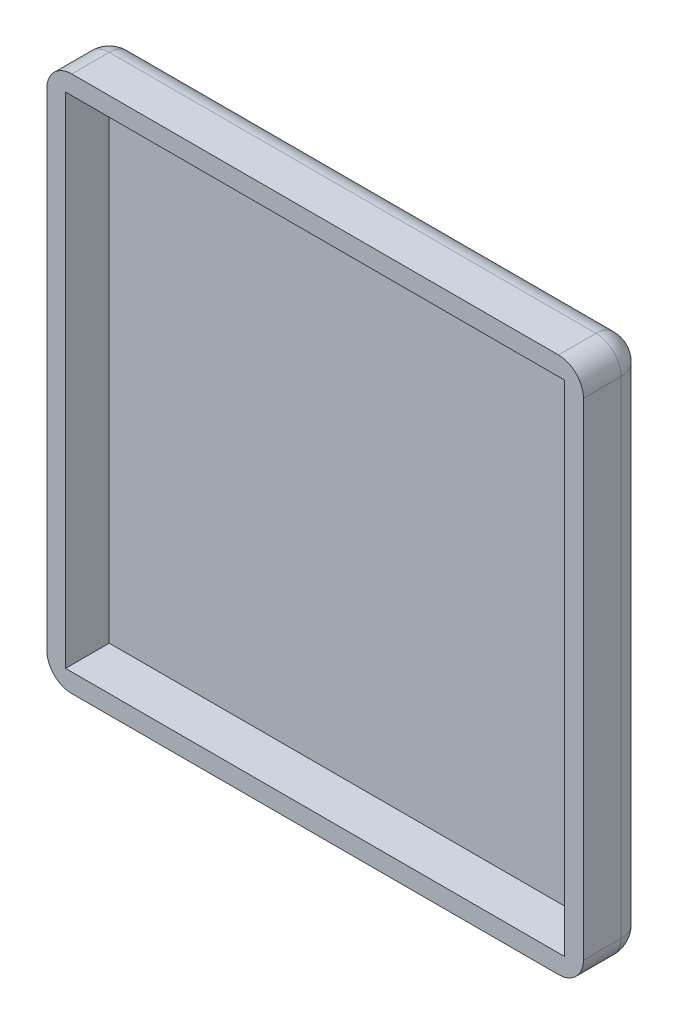
ISO-10303-21;
HEADER;
FILE_DESCRIPTION(('STEP AP214'),'2;1');
FILE_NAME('part.step','',(''),(''),'','','');
FILE_SCHEMA(('AUTOMOTIVE_DESIGN { 1 0 10303 214 1 1 1 1 }'));
ENDSEC;
DATA;
#1=APPLICATION_CONTEXT('core data for automotive mechanical design processes');
#2=APPLICATION_PROTOCOL_DEFINITION('international standard','automotive_design',2000,#1);
#3=PRODUCT_CONTEXT('',#1,'mechanical');
#4=PRODUCT('Part','Part','',(#3));
#5=PRODUCT_RELATED_PRODUCT_CATEGORY('part','',(#4));
#6=PRODUCT_DEFINITION_FORMATION('','',#4);
#7=PRODUCT_DEFINITION_CONTEXT('part definition',#1,'design');
#8=PRODUCT_DEFINITION('design','',#6,#7);
#9=PRODUCT_DEFINITION_SHAPE('','',#8);
#10=(LENGTH_UNIT() NAMED_UNIT(*) SI_UNIT(.MILLI.,.METRE.));
#11=(NAMED_UNIT(*) PLANE_ANGLE_UNIT() SI_UNIT($,.RADIAN.));
#12=(NAMED_UNIT(*) SI_UNIT($,.STERADIAN.) SOLID_ANGLE_UNIT());
#13=UNCERTAINTY_MEASURE_WITH_UNIT(LENGTH_MEASURE(1.E-05),#10,'distance_accuracy_value','');
#14=(GEOMETRIC_REPRESENTATION_CONTEXT(3) GLOBAL_UNCERTAINTY_ASSIGNED_CONTEXT((#13)) GLOBAL_UNIT_ASSIGNED_CONTEXT((#10,
#11,#12)) REPRESENTATION_CONTEXT('',''));
#15=CARTESIAN_POINT('',(0.,0.,0.));
#16=DIRECTION('',(0.,0.,1.));
#17=DIRECTION('',(1.,0.,0.));
#18=AXIS2_PLACEMENT_3D('',#15,#16,#17);
#19=CARTESIAN_POINT('',(-21.5,21.5,0.));
#20=DIRECTION('',(-1.,0.,0.));
#21=DIRECTION('',(0.,-1.,0.));
#22=AXIS2_PLACEMENT_3D('',#19,#20,#21);
#23=PLANE('',#22);
#24=DIRECTION('',(0.,-1.,0.));
#25=VECTOR('',#24,1.);
#26=CARTESIAN_POINT('',(-21.5,-21.5,2.));
#27=LINE('',#26,#25);
#28=CARTESIAN_POINT('',(-21.5,19.5,2.));
#29=VERTEX_POINT('',#28);
#30=CARTESIAN_POINT('',(-21.5,-19.5,2.));
#31=VERTEX_POINT('',#30);
#32=EDGE_CURVE('E190',#29,#31,#27,.T.);
#33=ORIENTED_EDGE('',*,*,#32,.T.);
#34=DIRECTION('',(0.,0.,1.));
#35=VECTOR('',#34,1.);
#36=CARTESIAN_POINT('',(-21.5,-19.5,0.));
#37=LINE('',#36,#35);
#38=CARTESIAN_POINT('',(-21.5,-19.5,5.));
#39=VERTEX_POINT('',#38);
#40=EDGE_CURVE('E192',#31,#39,#37,.T.);
#41=ORIENTED_EDGE('',*,*,#40,.T.);
#42=DIRECTION('',(0.,-1.,0.));
#43=VECTOR('',#42,1.);
#44=CARTESIAN_POINT('',(-21.5,21.5,5.));
#45=LINE('',#44,#43);
#46=CARTESIAN_POINT('',(-21.5,19.5,5.));
#47=VERTEX_POINT('',#46);
#48=EDGE_CURVE('E173',#47,#39,#45,.T.);
#49=ORIENTED_EDGE('',*,*,#48,.F.);
#50=DIRECTION('',(0.,0.,1.));
#51=VECTOR('',#50,1.);
#52=CARTESIAN_POINT('',(-21.5,19.5,0.));
#53=LINE('',#52,#51);
#54=EDGE_CURVE('E188',#47,#29,#53,.F.);
#55=ORIENTED_EDGE('',*,*,#54,.T.);
#56=EDGE_LOOP('',(#33,#41,#49,#55));
#57=FACE_BOUND('',#56,.T.);
#58=ADVANCED_FACE('F33',(#57),#23,.T.);
#59=CARTESIAN_POINT('',(21.5,21.5,0.));
#60=DIRECTION('',(0.,1.,0.));
#61=DIRECTION('',(0.,0.,1.));
#62=AXIS2_PLACEMENT_3D('',#59,#60,#61);
#63=PLANE('',#62);
#64=DIRECTION('',(-1.,0.,0.));
#65=VECTOR('',#64,1.);
#66=CARTESIAN_POINT('',(21.5,21.5,5.));
#67=LINE('',#66,#65);
#68=CARTESIAN_POINT('',(19.5,21.5,5.));
#69=VERTEX_POINT('',#68);
#70=CARTESIAN_POINT('',(-19.5,21.5,5.));
#71=VERTEX_POINT('',#70);
#72=EDGE_CURVE('E185',#69,#71,#67,.T.);
#73=ORIENTED_EDGE('',*,*,#72,.F.);
#74=DIRECTION('',(0.,0.,1.));
#75=VECTOR('',#74,1.);
#76=CARTESIAN_POINT('',(19.5,21.5,0.));
#77=LINE('',#76,#75);
#78=CARTESIAN_POINT('',(19.5,21.5,2.));
#79=VERTEX_POINT('',#78);
#80=EDGE_CURVE('E11',#69,#79,#77,.F.);
#81=ORIENTED_EDGE('',*,*,#80,.T.);
#82=DIRECTION('',(-1.,0.,0.));
#83=VECTOR('',#82,1.);
#84=CARTESIAN_POINT('',(-21.5,21.5,2.));
#85=LINE('',#84,#83);
#86=CARTESIAN_POINT('',(-19.5,21.5,2.));
#87=VERTEX_POINT('',#86);
#88=EDGE_CURVE('E49',#79,#87,#85,.T.);
#89=ORIENTED_EDGE('',*,*,#88,.T.);
#90=DIRECTION('',(0.,0.,1.));
#91=VECTOR('',#90,1.);
#92=CARTESIAN_POINT('',(-19.5,21.5,0.));
#93=LINE('',#92,#91);
#94=EDGE_CURVE('E42',#87,#71,#93,.T.);
#95=ORIENTED_EDGE('',*,*,#94,.T.);
#96=EDGE_LOOP('',(#73,#81,#89,#95));
#97=FACE_BOUND('',#96,.T.);
#98=ADVANCED_FACE('F305',(#97),#63,.T.);
#99=CARTESIAN_POINT('',(21.5,-21.5,0.));
#100=DIRECTION('',(1.,0.,0.));
#101=DIRECTION('',(0.,1.,0.));
#102=AXIS2_PLACEMENT_3D('',#99,#100,#101);
#103=PLANE('',#102);
#104=DIRECTION('',(0.,1.,0.));
#105=VECTOR('',#104,1.);
#106=CARTESIAN_POINT('',(21.5,-21.5,5.));
#107=LINE('',#106,#105);
#108=CARTESIAN_POINT('',(21.5,-19.5,5.));
#109=VERTEX_POINT('',#108);
#110=CARTESIAN_POINT('',(21.5,19.5,5.));
#111=VERTEX_POINT('',#110);
#112=EDGE_CURVE('E182',#109,#111,#107,.T.);
#113=ORIENTED_EDGE('',*,*,#112,.F.);
#114=DIRECTION('',(0.,0.,1.));
#115=VECTOR('',#114,1.);
#116=CARTESIAN_POINT('',(21.5,-19.5,0.));
#117=LINE('',#116,#115);
#118=CARTESIAN_POINT('',(21.5,-19.5,2.));
#119=VERTEX_POINT('',#118);
#120=EDGE_CURVE('E222',#109,#119,#117,.F.);
#121=ORIENTED_EDGE('',*,*,#120,.T.);
#122=DIRECTION('',(0.,1.,0.));
#123=VECTOR('',#122,1.);
#124=CARTESIAN_POINT('',(21.5,21.5,2.));
#125=LINE('',#124,#123);
#126=CARTESIAN_POINT('',(21.5,19.5,2.));
#127=VERTEX_POINT('',#126);
#128=EDGE_CURVE('E218',#119,#127,#125,.T.);
#129=ORIENTED_EDGE('',*,*,#128,.T.);
#130=DIRECTION('',(0.,0.,1.));
#131=VECTOR('',#130,1.);
#132=CARTESIAN_POINT('',(21.5,19.5,0.));
#133=LINE('',#132,#131);
#134=EDGE_CURVE('E220',#127,#111,#133,.T.);
#135=ORIENTED_EDGE('',*,*,#134,.T.);
#136=EDGE_LOOP('',(#113,#121,#129,#135));
#137=FACE_BOUND('',#136,.T.);
#138=ADVANCED_FACE('F269',(#137),#103,.T.);
#139=CARTESIAN_POINT('',(-21.5,-21.5,0.));
#140=DIRECTION('',(0.,-1.,0.));
#141=DIRECTION('',(0.,0.,-1.));
#142=AXIS2_PLACEMENT_3D('',#139,#140,#141);
#143=PLANE('',#142);
#144=DIRECTION('',(1.,0.,0.));
#145=VECTOR('',#144,1.);
#146=CARTESIAN_POINT('',(-21.5,-21.5,5.));
#147=LINE('',#146,#145);
#148=CARTESIAN_POINT('',(-19.5,-21.5,5.));
#149=VERTEX_POINT('',#148);
#150=CARTESIAN_POINT('',(19.5,-21.5,5.));
#151=VERTEX_POINT('',#150);
#152=EDGE_CURVE('E179',#149,#151,#147,.T.);
#153=ORIENTED_EDGE('',*,*,#152,.F.);
#154=DIRECTION('',(0.,0.,1.));
#155=VECTOR('',#154,1.);
#156=CARTESIAN_POINT('',(-19.5,-21.5,0.));
#157=LINE('',#156,#155);
#158=CARTESIAN_POINT('',(-19.5,-21.5,2.));
#159=VERTEX_POINT('',#158);
#160=EDGE_CURVE('E207',#149,#159,#157,.F.);
#161=ORIENTED_EDGE('',*,*,#160,.T.);
#162=DIRECTION('',(1.,0.,0.));
#163=VECTOR('',#162,1.);
#164=CARTESIAN_POINT('',(21.5,-21.5,2.));
#165=LINE('',#164,#163);
#166=CARTESIAN_POINT('',(19.5,-21.5,2.));
#167=VERTEX_POINT('',#166);
#168=EDGE_CURVE('E205',#159,#167,#165,.T.);
#169=ORIENTED_EDGE('',*,*,#168,.T.);
#170=DIRECTION('',(0.,0.,1.));
#171=VECTOR('',#170,1.);
#172=CARTESIAN_POINT('',(19.5,-21.5,0.));
#173=LINE('',#172,#171);
#174=EDGE_CURVE('E203',#167,#151,#173,.T.);
#175=ORIENTED_EDGE('',*,*,#174,.T.);
#176=EDGE_LOOP('',(#153,#161,#169,#175));
#177=FACE_BOUND('',#176,.T.);
#178=ADVANCED_FACE('F315',(#177),#143,.T.);
#179=CARTESIAN_POINT('',(0.,0.,0.));
#180=DIRECTION('',(0.,0.,1.));
#181=DIRECTION('',(1.,0.,0.));
#182=AXIS2_PLACEMENT_3D('',#179,#180,#181);
#183=PLANE('',#182);
#184=DIRECTION('',(0.,1.,0.));
#185=VECTOR('',#184,1.);
#186=CARTESIAN_POINT('',(19.5,-21.5,0.));
#187=LINE('',#186,#185);
#188=CARTESIAN_POINT('',(19.5,19.5,0.));
#189=VERTEX_POINT('',#188);
#190=CARTESIAN_POINT('',(19.5,-19.5,0.));
#191=VERTEX_POINT('',#190);
#192=EDGE_CURVE('E211',#189,#191,#187,.F.);
#193=ORIENTED_EDGE('',*,*,#192,.T.);
#194=DIRECTION('',(1.,0.,0.));
#195=VECTOR('',#194,1.);
#196=CARTESIAN_POINT('',(-21.5,-19.5,0.));
#197=LINE('',#196,#195);
#198=CARTESIAN_POINT('',(-19.5,-19.5,0.));
#199=VERTEX_POINT('',#198);
#200=EDGE_CURVE('E215',#191,#199,#197,.F.);
#201=ORIENTED_EDGE('',*,*,#200,.T.);
#202=DIRECTION('',(0.,-1.,0.));
#203=VECTOR('',#202,1.);
#204=CARTESIAN_POINT('',(-19.5,21.5,0.));
#205=LINE('',#204,#203);
#206=CARTESIAN_POINT('',(-19.5,19.5,0.));
#207=VERTEX_POINT('',#206);
#208=EDGE_CURVE('E213',#199,#207,#205,.F.);
#209=ORIENTED_EDGE('',*,*,#208,.T.);
#210=DIRECTION('',(-1.,0.,0.));
#211=VECTOR('',#210,1.);
#212=CARTESIAN_POINT('',(21.5,19.5,0.));
#213=LINE('',#212,#211);
#214=EDGE_CURVE('E209',#207,#189,#213,.F.);
#215=ORIENTED_EDGE('',*,*,#214,.T.);
#216=EDGE_LOOP('',(#193,#201,#209,#215));
#217=FACE_BOUND('',#216,.T.);
#218=ADVANCED_FACE('F291',(#217),#183,.F.);
#219=CARTESIAN_POINT('',(0.,0.,5.));
#220=DIRECTION('',(0.,0.,1.));
#221=DIRECTION('',(1.,0.,0.));
#222=AXIS2_PLACEMENT_3D('',#219,#220,#221);
#223=PLANE('',#222);
#224=DIRECTION('',(0.,-1.,0.));
#225=VECTOR('',#224,1.);
#226=CARTESIAN_POINT('',(-20.,20.,5.));
#227=LINE('',#226,#225);
#228=CARTESIAN_POINT('',(-20.,20.,5.));
#229=VERTEX_POINT('',#228);
#230=CARTESIAN_POINT('',(-20.,-20.,5.));
#231=VERTEX_POINT('',#230);
#232=EDGE_CURVE('E141',#229,#231,#227,.T.);
#233=ORIENTED_EDGE('',*,*,#232,.F.);
#234=DIRECTION('',(-1.,0.,0.));
#235=VECTOR('',#234,1.);
#236=CARTESIAN_POINT('',(20.,20.,5.));
#237=LINE('',#236,#235);
#238=CARTESIAN_POINT('',(20.,20.,5.));
#239=VERTEX_POINT('',#238);
#240=EDGE_CURVE('E158',#239,#229,#237,.T.);
#241=ORIENTED_EDGE('',*,*,#240,.F.);
#242=DIRECTION('',(0.,1.,0.));
#243=VECTOR('',#242,1.);
#244=CARTESIAN_POINT('',(20.,-20.,5.));
#245=LINE('',#244,#243);
#246=CARTESIAN_POINT('',(20.,-20.,5.));
#247=VERTEX_POINT('',#246);
#248=EDGE_CURVE('E161',#247,#239,#245,.T.);
#249=ORIENTED_EDGE('',*,*,#248,.F.);
#250=DIRECTION('',(1.,0.,0.));
#251=VECTOR('',#250,1.);
#252=CARTESIAN_POINT('',(-20.,-20.,5.));
#253=LINE('',#252,#251);
#254=EDGE_CURVE('E167',#231,#247,#253,.T.);
#255=ORIENTED_EDGE('',*,*,#254,.F.);
#256=EDGE_LOOP('',(#233,#241,#249,#255));
#257=FACE_BOUND('',#256,.T.);
#258=ORIENTED_EDGE('',*,*,#48,.T.);
#259=CARTESIAN_POINT('',(-19.5,-19.5,5.));
#260=DIRECTION('',(0.,0.,1.));
#261=DIRECTION('',(1.,0.,0.));
#262=AXIS2_PLACEMENT_3D('',#259,#260,#261);
#263=CIRCLE('',#262,2.);
#264=EDGE_CURVE('E201',#39,#149,#263,.T.);
#265=ORIENTED_EDGE('',*,*,#264,.T.);
#266=ORIENTED_EDGE('',*,*,#152,.T.);
#267=CARTESIAN_POINT('',(19.5,-19.5,5.));
#268=DIRECTION('',(0.,0.,1.));
#269=DIRECTION('',(1.,0.,0.));
#270=AXIS2_PLACEMENT_3D('',#267,#268,#269);
#271=CIRCLE('',#270,2.);
#272=EDGE_CURVE('E199',#151,#109,#271,.T.);
#273=ORIENTED_EDGE('',*,*,#272,.T.);
#274=ORIENTED_EDGE('',*,*,#112,.T.);
#275=CARTESIAN_POINT('',(19.5,19.5,5.));
#276=DIRECTION('',(0.,0.,1.));
#277=DIRECTION('',(1.,0.,0.));
#278=AXIS2_PLACEMENT_3D('',#275,#276,#277);
#279=CIRCLE('',#278,2.);
#280=EDGE_CURVE('E197',#111,#69,#279,.T.);
#281=ORIENTED_EDGE('',*,*,#280,.T.);
#282=ORIENTED_EDGE('',*,*,#72,.T.);
#283=CARTESIAN_POINT('',(-19.5,19.5,5.));
#284=DIRECTION('',(0.,0.,1.));
#285=DIRECTION('',(1.,0.,0.));
#286=AXIS2_PLACEMENT_3D('',#283,#284,#285);
#287=CIRCLE('',#286,2.);
#288=EDGE_CURVE('E195',#71,#47,#287,.T.);
#289=ORIENTED_EDGE('',*,*,#288,.T.);
#290=EDGE_LOOP('',(#258,#265,#266,#273,#274,#281,#282,#289));
#291=FACE_BOUND('',#290,.T.);
#292=ADVANCED_FACE('F272',(#257,#291),#223,.T.);
#293=CARTESIAN_POINT('',(-20.,20.,1.5));
#294=DIRECTION('',(-1.,0.,0.));
#295=DIRECTION('',(0.,0.,1.));
#296=AXIS2_PLACEMENT_3D('',#293,#294,#295);
#297=PLANE('',#296);
#298=ORIENTED_EDGE('',*,*,#232,.T.);
#299=DIRECTION('',(0.,0.,1.));
#300=VECTOR('',#299,1.);
#301=CARTESIAN_POINT('',(-20.,-20.,1.5));
#302=LINE('',#301,#300);
#303=CARTESIAN_POINT('',(-20.,-20.,1.5));
#304=VERTEX_POINT('',#303);
#305=EDGE_CURVE('E134',#304,#231,#302,.T.);
#306=ORIENTED_EDGE('',*,*,#305,.F.);
#307=DIRECTION('',(0.,-1.,0.));
#308=VECTOR('',#307,1.);
#309=CARTESIAN_POINT('',(-20.,20.,1.5));
#310=LINE('',#309,#308);
#311=CARTESIAN_POINT('',(-20.,20.,1.5));
#312=VERTEX_POINT('',#311);
#313=EDGE_CURVE('E138',#312,#304,#310,.T.);
#314=ORIENTED_EDGE('',*,*,#313,.F.);
#315=DIRECTION('',(0.,0.,1.));
#316=VECTOR('',#315,1.);
#317=CARTESIAN_POINT('',(-20.,20.,1.5));
#318=LINE('',#317,#316);
#319=EDGE_CURVE('E171',#312,#229,#318,.T.);
#320=ORIENTED_EDGE('',*,*,#319,.T.);
#321=EDGE_LOOP('',(#298,#306,#314,#320));
#322=FACE_BOUND('',#321,.T.);
#323=ADVANCED_FACE('F136',(#322),#297,.F.);
#324=CARTESIAN_POINT('',(20.,20.,1.5));
#325=DIRECTION('',(0.,1.,0.));
#326=DIRECTION('',(0.,0.,1.));
#327=AXIS2_PLACEMENT_3D('',#324,#325,#326);
#328=PLANE('',#327);
#329=ORIENTED_EDGE('',*,*,#240,.T.);
#330=ORIENTED_EDGE('',*,*,#319,.F.);
#331=DIRECTION('',(-1.,0.,0.));
#332=VECTOR('',#331,1.);
#333=CARTESIAN_POINT('',(20.,20.,1.5));
#334=LINE('',#333,#332);
#335=CARTESIAN_POINT('',(20.,20.,1.5));
#336=VERTEX_POINT('',#335);
#337=EDGE_CURVE('E146',#336,#312,#334,.T.);
#338=ORIENTED_EDGE('',*,*,#337,.F.);
#339=DIRECTION('',(0.,0.,1.));
#340=VECTOR('',#339,1.);
#341=CARTESIAN_POINT('',(20.,20.,1.5));
#342=LINE('',#341,#340);
#343=EDGE_CURVE('E174',#336,#239,#342,.T.);
#344=ORIENTED_EDGE('',*,*,#343,.T.);
#345=EDGE_LOOP('',(#329,#330,#338,#344));
#346=FACE_BOUND('',#345,.T.);
#347=ADVANCED_FACE('F485',(#346),#328,.F.);
#348=CARTESIAN_POINT('',(20.,-20.,1.5));
#349=DIRECTION('',(1.,0.,0.));
#350=DIRECTION('',(0.,0.,-1.));
#351=AXIS2_PLACEMENT_3D('',#348,#349,#350);
#352=PLANE('',#351);
#353=ORIENTED_EDGE('',*,*,#248,.T.);
#354=ORIENTED_EDGE('',*,*,#343,.F.);
#355=DIRECTION('',(0.,1.,0.));
#356=VECTOR('',#355,1.);
#357=CARTESIAN_POINT('',(20.,-20.,1.5));
#358=LINE('',#357,#356);
#359=CARTESIAN_POINT('',(20.,-20.,1.5));
#360=VERTEX_POINT('',#359);
#361=EDGE_CURVE('E154',#360,#336,#358,.T.);
#362=ORIENTED_EDGE('',*,*,#361,.F.);
#363=DIRECTION('',(0.,0.,1.));
#364=VECTOR('',#363,1.);
#365=CARTESIAN_POINT('',(20.,-20.,1.5));
#366=LINE('',#365,#364);
#367=EDGE_CURVE('E145',#360,#247,#366,.T.);
#368=ORIENTED_EDGE('',*,*,#367,.T.);
#369=EDGE_LOOP('',(#353,#354,#362,#368));
#370=FACE_BOUND('',#369,.T.);
#371=ADVANCED_FACE('F476',(#370),#352,.F.);
#372=CARTESIAN_POINT('',(-20.,-20.,1.5));
#373=DIRECTION('',(0.,-1.,0.));
#374=DIRECTION('',(0.,0.,-1.));
#375=AXIS2_PLACEMENT_3D('',#372,#373,#374);
#376=PLANE('',#375);
#377=ORIENTED_EDGE('',*,*,#254,.T.);
#378=ORIENTED_EDGE('',*,*,#367,.F.);
#379=DIRECTION('',(1.,0.,0.));
#380=VECTOR('',#379,1.);
#381=CARTESIAN_POINT('',(-20.,-20.,1.5));
#382=LINE('',#381,#380);
#383=EDGE_CURVE('E149',#304,#360,#382,.T.);
#384=ORIENTED_EDGE('',*,*,#383,.F.);
#385=ORIENTED_EDGE('',*,*,#305,.T.);
#386=EDGE_LOOP('',(#377,#378,#384,#385));
#387=FACE_BOUND('',#386,.T.);
#388=ADVANCED_FACE('F150',(#387),#376,.F.);
#389=CARTESIAN_POINT('',(0.,0.,1.5));
#390=DIRECTION('',(0.,0.,1.));
#391=DIRECTION('',(1.,0.,0.));
#392=AXIS2_PLACEMENT_3D('',#389,#390,#391);
#393=PLANE('',#392);
#394=ORIENTED_EDGE('',*,*,#313,.T.);
#395=ORIENTED_EDGE('',*,*,#383,.T.);
#396=ORIENTED_EDGE('',*,*,#361,.T.);
#397=ORIENTED_EDGE('',*,*,#337,.T.);
#398=EDGE_LOOP('',(#394,#395,#396,#397));
#399=FACE_BOUND('',#398,.T.);
#400=ADVANCED_FACE('F156',(#399),#393,.T.);
#401=CARTESIAN_POINT('',(19.5,19.5,0.));
#402=DIRECTION('',(0.,0.,1.));
#403=DIRECTION('',(1.,0.,0.));
#404=AXIS2_PLACEMENT_3D('',#401,#402,#403);
#405=CYLINDRICAL_SURFACE('',#404,2.);
#406=CARTESIAN_POINT('',(19.5,19.5,2.));
#407=DIRECTION('',(0.,0.,-1.));
#408=DIRECTION('',(-1.,0.,0.));
#409=AXIS2_PLACEMENT_3D('',#406,#407,#408);
#410=CIRCLE('',#409,2.);
#411=EDGE_CURVE('E37',#79,#127,#410,.T.);
#412=ORIENTED_EDGE('',*,*,#411,.F.);
#413=ORIENTED_EDGE('',*,*,#80,.F.);
#414=ORIENTED_EDGE('',*,*,#280,.F.);
#415=ORIENTED_EDGE('',*,*,#134,.F.);
#416=EDGE_LOOP('',(#412,#413,#414,#415));
#417=FACE_BOUND('',#416,.T.);
#418=ADVANCED_FACE('F35',(#417),#405,.T.);
#419=CARTESIAN_POINT('',(19.5,19.5,2.));
#420=DIRECTION('',(1.,0.,0.));
#421=DIRECTION('',(0.,0.,-1.));
#422=AXIS2_PLACEMENT_3D('',#419,#420,#421);
#423=SPHERICAL_SURFACE('',#422,2.);
#424=CARTESIAN_POINT('',(19.5,19.5,2.));
#425=DIRECTION('',(1.,0.,0.));
#426=DIRECTION('',(0.,0.,-1.));
#427=AXIS2_PLACEMENT_3D('',#424,#425,#426);
#428=CIRCLE('',#427,2.);
#429=EDGE_CURVE('E252',#79,#189,#428,.F.);
#430=ORIENTED_EDGE('',*,*,#429,.F.);
#431=ORIENTED_EDGE('',*,*,#411,.T.);
#432=CARTESIAN_POINT('',(19.5,19.5,2.));
#433=DIRECTION('',(0.,1.,0.));
#434=DIRECTION('',(0.,0.,1.));
#435=AXIS2_PLACEMENT_3D('',#432,#433,#434);
#436=CIRCLE('',#435,2.);
#437=EDGE_CURVE('E254',#189,#127,#436,.F.);
#438=ORIENTED_EDGE('',*,*,#437,.F.);
#439=EDGE_LOOP('',(#430,#431,#438));
#440=FACE_BOUND('',#439,.T.);
#441=ADVANCED_FACE('F263',(#440),#423,.T.);
#442=CARTESIAN_POINT('',(19.5,-19.5,0.));
#443=DIRECTION('',(0.,0.,1.));
#444=DIRECTION('',(1.,0.,0.));
#445=AXIS2_PLACEMENT_3D('',#442,#443,#444);
#446=CYLINDRICAL_SURFACE('',#445,2.);
#447=ORIENTED_EDGE('',*,*,#272,.F.);
#448=ORIENTED_EDGE('',*,*,#174,.F.);
#449=CARTESIAN_POINT('',(19.5,-19.5,2.));
#450=DIRECTION('',(0.,0.,-1.));
#451=DIRECTION('',(-1.,0.,0.));
#452=AXIS2_PLACEMENT_3D('',#449,#450,#451);
#453=CIRCLE('',#452,2.);
#454=EDGE_CURVE('E249',#119,#167,#453,.T.);
#455=ORIENTED_EDGE('',*,*,#454,.F.);
#456=ORIENTED_EDGE('',*,*,#120,.F.);
#457=EDGE_LOOP('',(#447,#448,#455,#456));
#458=FACE_BOUND('',#457,.T.);
#459=ADVANCED_FACE('F277',(#458),#446,.T.);
#460=CARTESIAN_POINT('',(19.5,-21.5,2.));
#461=DIRECTION('',(0.,-1.,0.));
#462=DIRECTION('',(1.,0.,0.));
#463=AXIS2_PLACEMENT_3D('',#460,#461,#462);
#464=CYLINDRICAL_SURFACE('',#463,2.);
#465=ORIENTED_EDGE('',*,*,#437,.T.);
#466=ORIENTED_EDGE('',*,*,#128,.F.);
#467=CARTESIAN_POINT('',(19.5,-19.5,2.));
#468=DIRECTION('',(0.,-1.,0.));
#469=DIRECTION('',(0.,0.,-1.));
#470=AXIS2_PLACEMENT_3D('',#467,#468,#469);
#471=CIRCLE('',#470,2.);
#472=EDGE_CURVE('E246',#191,#119,#471,.T.);
#473=ORIENTED_EDGE('',*,*,#472,.F.);
#474=ORIENTED_EDGE('',*,*,#192,.F.);
#475=EDGE_LOOP('',(#465,#466,#473,#474));
#476=FACE_BOUND('',#475,.T.);
#477=ADVANCED_FACE('F280',(#476),#464,.T.);
#478=CARTESIAN_POINT('',(21.5,19.5,2.));
#479=DIRECTION('',(1.,0.,0.));
#480=DIRECTION('',(0.,0.,-1.));
#481=AXIS2_PLACEMENT_3D('',#478,#479,#480);
#482=CYLINDRICAL_SURFACE('',#481,2.);
#483=ORIENTED_EDGE('',*,*,#429,.T.);
#484=ORIENTED_EDGE('',*,*,#214,.F.);
#485=CARTESIAN_POINT('',(-19.5,19.5,2.));
#486=DIRECTION('',(-1.,0.,0.));
#487=DIRECTION('',(0.,0.,1.));
#488=AXIS2_PLACEMENT_3D('',#485,#486,#487);
#489=CIRCLE('',#488,2.);
#490=EDGE_CURVE('E243',#87,#207,#489,.T.);
#491=ORIENTED_EDGE('',*,*,#490,.F.);
#492=ORIENTED_EDGE('',*,*,#88,.F.);
#493=EDGE_LOOP('',(#483,#484,#491,#492));
#494=FACE_BOUND('',#493,.T.);
#495=ADVANCED_FACE('F295',(#494),#482,.T.);
#496=CARTESIAN_POINT('',(-19.5,19.5,0.));
#497=DIRECTION('',(0.,0.,1.));
#498=DIRECTION('',(1.,0.,0.));
#499=AXIS2_PLACEMENT_3D('',#496,#497,#498);
#500=CYLINDRICAL_SURFACE('',#499,2.);
#501=ORIENTED_EDGE('',*,*,#288,.F.);
#502=ORIENTED_EDGE('',*,*,#94,.F.);
#503=CARTESIAN_POINT('',(-19.5,19.5,2.));
#504=DIRECTION('',(0.,0.,-1.));
#505=DIRECTION('',(-1.,0.,0.));
#506=AXIS2_PLACEMENT_3D('',#503,#504,#505);
#507=CIRCLE('',#506,2.);
#508=EDGE_CURVE('E240',#29,#87,#507,.T.);
#509=ORIENTED_EDGE('',*,*,#508,.F.);
#510=ORIENTED_EDGE('',*,*,#54,.F.);
#511=EDGE_LOOP('',(#501,#502,#509,#510));
#512=FACE_BOUND('',#511,.T.);
#513=ADVANCED_FACE('F304',(#512),#500,.T.);
#514=CARTESIAN_POINT('',(19.5,-19.5,2.));
#515=DIRECTION('',(1.,0.,0.));
#516=DIRECTION('',(0.,0.,-1.));
#517=AXIS2_PLACEMENT_3D('',#514,#515,#516);
#518=SPHERICAL_SURFACE('',#517,2.);
#519=ORIENTED_EDGE('',*,*,#472,.T.);
#520=ORIENTED_EDGE('',*,*,#454,.T.);
#521=CARTESIAN_POINT('',(19.5,-19.5,2.));
#522=DIRECTION('',(1.,0.,0.));
#523=DIRECTION('',(0.,0.,-1.));
#524=AXIS2_PLACEMENT_3D('',#521,#522,#523);
#525=CIRCLE('',#524,2.);
#526=EDGE_CURVE('E237',#191,#167,#525,.F.);
#527=ORIENTED_EDGE('',*,*,#526,.F.);
#528=EDGE_LOOP('',(#519,#520,#527));
#529=FACE_BOUND('',#528,.T.);
#530=ADVANCED_FACE('F284',(#529),#518,.T.);
#531=CARTESIAN_POINT('',(-19.5,19.5,2.));
#532=DIRECTION('',(0.,1.,0.));
#533=DIRECTION('',(0.,0.,1.));
#534=AXIS2_PLACEMENT_3D('',#531,#532,#533);
#535=SPHERICAL_SURFACE('',#534,2.);
#536=ORIENTED_EDGE('',*,*,#508,.T.);
#537=ORIENTED_EDGE('',*,*,#490,.T.);
#538=CARTESIAN_POINT('',(-19.5,19.5,2.));
#539=DIRECTION('',(0.,1.,0.));
#540=DIRECTION('',(0.,0.,1.));
#541=AXIS2_PLACEMENT_3D('',#538,#539,#540);
#542=CIRCLE('',#541,2.);
#543=EDGE_CURVE('E234',#29,#207,#542,.F.);
#544=ORIENTED_EDGE('',*,*,#543,.F.);
#545=EDGE_LOOP('',(#536,#537,#544));
#546=FACE_BOUND('',#545,.T.);
#547=ADVANCED_FACE('F299',(#546),#535,.T.);
#548=CARTESIAN_POINT('',(-21.5,-19.5,2.));
#549=DIRECTION('',(-1.,0.,0.));
#550=DIRECTION('',(0.,0.,1.));
#551=AXIS2_PLACEMENT_3D('',#548,#549,#550);
#552=CYLINDRICAL_SURFACE('',#551,2.);
#553=ORIENTED_EDGE('',*,*,#526,.T.);
#554=ORIENTED_EDGE('',*,*,#168,.F.);
#555=CARTESIAN_POINT('',(-19.5,-19.5,2.));
#556=DIRECTION('',(-1.,0.,0.));
#557=DIRECTION('',(0.,0.,1.));
#558=AXIS2_PLACEMENT_3D('',#555,#556,#557);
#559=CIRCLE('',#558,2.);
#560=EDGE_CURVE('E231',#199,#159,#559,.T.);
#561=ORIENTED_EDGE('',*,*,#560,.F.);
#562=ORIENTED_EDGE('',*,*,#200,.F.);
#563=EDGE_LOOP('',(#553,#554,#561,#562));
#564=FACE_BOUND('',#563,.T.);
#565=ADVANCED_FACE('F288',(#564),#552,.T.);
#566=CARTESIAN_POINT('',(-19.5,21.5,2.));
#567=DIRECTION('',(0.,1.,0.));
#568=DIRECTION('',(-1.,0.,0.));
#569=AXIS2_PLACEMENT_3D('',#566,#567,#568);
#570=CYLINDRICAL_SURFACE('',#569,2.);
#571=ORIENTED_EDGE('',*,*,#543,.T.);
#572=ORIENTED_EDGE('',*,*,#208,.F.);
#573=CARTESIAN_POINT('',(-19.5,-19.5,2.));
#574=DIRECTION('',(0.,-1.,0.));
#575=DIRECTION('',(0.,0.,-1.));
#576=AXIS2_PLACEMENT_3D('',#573,#574,#575);
#577=CIRCLE('',#576,2.);
#578=EDGE_CURVE('E229',#31,#199,#577,.T.);
#579=ORIENTED_EDGE('',*,*,#578,.F.);
#580=ORIENTED_EDGE('',*,*,#32,.F.);
#581=EDGE_LOOP('',(#571,#572,#579,#580));
#582=FACE_BOUND('',#581,.T.);
#583=ADVANCED_FACE('F319',(#582),#570,.T.);
#584=CARTESIAN_POINT('',(-19.5,-19.5,2.));
#585=DIRECTION('',(0.,0.,-1.));
#586=DIRECTION('',(-1.,0.,0.));
#587=AXIS2_PLACEMENT_3D('',#584,#585,#586);
#588=SPHERICAL_SURFACE('',#587,2.);
#589=ORIENTED_EDGE('',*,*,#578,.T.);
#590=ORIENTED_EDGE('',*,*,#560,.T.);
#591=CARTESIAN_POINT('',(-19.5,-19.5,2.));
#592=DIRECTION('',(0.,0.,-1.));
#593=DIRECTION('',(-1.,0.,0.));
#594=AXIS2_PLACEMENT_3D('',#591,#592,#593);
#595=CIRCLE('',#594,2.);
#596=EDGE_CURVE('E226',#31,#159,#595,.F.);
#597=ORIENTED_EDGE('',*,*,#596,.F.);
#598=EDGE_LOOP('',(#589,#590,#597));
#599=FACE_BOUND('',#598,.T.);
#600=ADVANCED_FACE('F317',(#599),#588,.T.);
#601=CARTESIAN_POINT('',(-19.5,-19.5,0.));
#602=DIRECTION('',(0.,0.,1.));
#603=DIRECTION('',(1.,0.,0.));
#604=AXIS2_PLACEMENT_3D('',#601,#602,#603);
#605=CYLINDRICAL_SURFACE('',#604,2.);
#606=ORIENTED_EDGE('',*,*,#596,.T.);
#607=ORIENTED_EDGE('',*,*,#160,.F.);
#608=ORIENTED_EDGE('',*,*,#264,.F.);
#609=ORIENTED_EDGE('',*,*,#40,.F.);
#610=EDGE_LOOP('',(#606,#607,#608,#609));
#611=FACE_BOUND('',#610,.T.);
#612=ADVANCED_FACE('F311',(#611),#605,.T.);
#613=CLOSED_SHELL('',(#58,#98,#138,#178,#218,#292,#323,#347,#371,#388,#400,#418,#441,#459,#477,
#495,#513,#530,#547,#565,#583,#600,#612));
#614=MANIFOLD_SOLID_BREP('B2',#613);
#615=ADVANCED_BREP_SHAPE_REPRESENTATION('',(#18,#614),#14);
#616=SHAPE_DEFINITION_REPRESENTATION(#9,#615);
ENDSEC;
END-ISO-10303-21;
